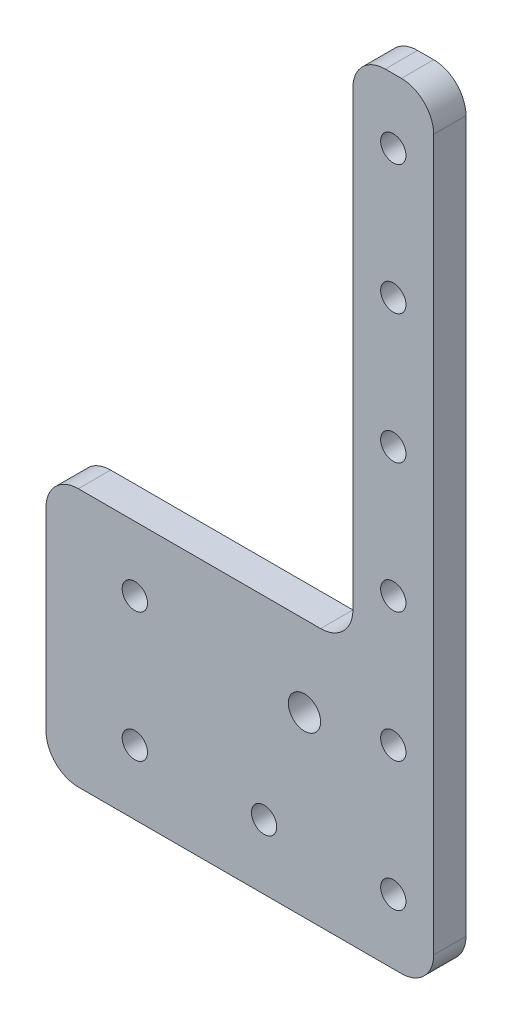
ISO-10303-21;
HEADER;
FILE_DESCRIPTION(('STEP AP214'),'2;1');
FILE_NAME('part.step','',(''),(''),'','','');
FILE_SCHEMA(('AUTOMOTIVE_DESIGN { 1 0 10303 214 1 1 1 1 }'));
ENDSEC;
DATA;
#1=APPLICATION_CONTEXT('core data for automotive mechanical design processes');
#2=APPLICATION_PROTOCOL_DEFINITION('international standard','automotive_design',2000,#1);
#3=PRODUCT_CONTEXT('',#1,'mechanical');
#4=PRODUCT('Part','Part','',(#3));
#5=PRODUCT_RELATED_PRODUCT_CATEGORY('part','',(#4));
#6=PRODUCT_DEFINITION_FORMATION('','',#4);
#7=PRODUCT_DEFINITION_CONTEXT('part definition',#1,'design');
#8=PRODUCT_DEFINITION('design','',#6,#7);
#9=PRODUCT_DEFINITION_SHAPE('','',#8);
#10=(LENGTH_UNIT() NAMED_UNIT(*) SI_UNIT(.MILLI.,.METRE.));
#11=(NAMED_UNIT(*) PLANE_ANGLE_UNIT() SI_UNIT($,.RADIAN.));
#12=(NAMED_UNIT(*) SI_UNIT($,.STERADIAN.) SOLID_ANGLE_UNIT());
#13=UNCERTAINTY_MEASURE_WITH_UNIT(LENGTH_MEASURE(1.E-05),#10,'distance_accuracy_value','');
#14=(GEOMETRIC_REPRESENTATION_CONTEXT(3) GLOBAL_UNCERTAINTY_ASSIGNED_CONTEXT((#13)) GLOBAL_UNIT_ASSIGNED_CONTEXT((#10,
#11,#12)) REPRESENTATION_CONTEXT('',''));
#15=CARTESIAN_POINT('',(0.,0.,0.));
#16=DIRECTION('',(0.,0.,1.));
#17=DIRECTION('',(1.,0.,0.));
#18=AXIS2_PLACEMENT_3D('',#15,#16,#17);
#19=CARTESIAN_POINT('',(0.,0.,3.175));
#20=DIRECTION('',(0.,0.,1.));
#21=DIRECTION('',(1.,0.,0.));
#22=AXIS2_PLACEMENT_3D('',#19,#20,#21);
#23=PLANE('',#22);
#24=CARTESIAN_POINT('',(284.1625,38.1,3.175));
#25=DIRECTION('',(0.,0.,1.));
#26=DIRECTION('',(1.,0.,0.));
#27=AXIS2_PLACEMENT_3D('',#24,#25,#26);
#28=CIRCLE('',#27,2.48920000000001);
#29=CARTESIAN_POINT('',(286.6517,38.1,3.175));
#30=VERTEX_POINT('',#29);
#31=EDGE_CURVE('E523',#30,#30,#28,.T.);
#32=ORIENTED_EDGE('',*,*,#31,.F.);
#33=EDGE_LOOP('',(#32));
#34=FACE_BOUND('',#33,.T.);
#35=CARTESIAN_POINT('',(317.5,34.925,3.175));
#36=DIRECTION('',(0.,0.,1.));
#37=DIRECTION('',(1.,0.,0.));
#38=AXIS2_PLACEMENT_3D('',#35,#36,#37);
#39=CIRCLE('',#38,3.17499999999997);
#40=CARTESIAN_POINT('',(320.675,34.925,3.175));
#41=VERTEX_POINT('',#40);
#42=EDGE_CURVE('E531',#41,#41,#39,.T.);
#43=ORIENTED_EDGE('',*,*,#42,.F.);
#44=EDGE_LOOP('',(#43));
#45=FACE_BOUND('',#44,.T.);
#46=CARTESIAN_POINT('',(334.9625,38.0999999999999,3.175));
#47=DIRECTION('',(0.,0.,1.));
#48=DIRECTION('',(1.,0.,0.));
#49=AXIS2_PLACEMENT_3D('',#46,#47,#48);
#50=CIRCLE('',#49,2.48920000000001);
#51=CARTESIAN_POINT('',(337.4517,38.0999999999999,3.175));
#52=VERTEX_POINT('',#51);
#53=EDGE_CURVE('E539',#52,#52,#50,.T.);
#54=ORIENTED_EDGE('',*,*,#53,.F.);
#55=EDGE_LOOP('',(#54));
#56=FACE_BOUND('',#55,.T.);
#57=CARTESIAN_POINT('',(334.9625,88.8999999999999,3.175));
#58=DIRECTION('',(0.,0.,1.));
#59=DIRECTION('',(1.,0.,0.));
#60=AXIS2_PLACEMENT_3D('',#57,#58,#59);
#61=CIRCLE('',#60,2.48920000000001);
#62=CARTESIAN_POINT('',(337.4517,88.8999999999999,3.175));
#63=VERTEX_POINT('',#62);
#64=EDGE_CURVE('E547',#63,#63,#61,.T.);
#65=ORIENTED_EDGE('',*,*,#64,.F.);
#66=EDGE_LOOP('',(#65));
#67=FACE_BOUND('',#66,.T.);
#68=CARTESIAN_POINT('',(334.9625,139.7,3.175));
#69=DIRECTION('',(0.,0.,1.));
#70=DIRECTION('',(1.,0.,0.));
#71=AXIS2_PLACEMENT_3D('',#68,#69,#70);
#72=CIRCLE('',#71,2.48920000000001);
#73=CARTESIAN_POINT('',(337.4517,139.7,3.175));
#74=VERTEX_POINT('',#73);
#75=EDGE_CURVE('E235',#74,#74,#72,.T.);
#76=ORIENTED_EDGE('',*,*,#75,.F.);
#77=EDGE_LOOP('',(#76));
#78=FACE_BOUND('',#77,.T.);
#79=DIRECTION('',(-1.,0.,0.));
#80=VECTOR('',#79,1.);
#81=CARTESIAN_POINT('',(327.025,50.7999999999999,3.175));
#82=LINE('',#81,#80);
#83=CARTESIAN_POINT('',(320.675,50.7999999999999,3.175));
#84=VERTEX_POINT('',#83);
#85=CARTESIAN_POINT('',(273.05,50.8,3.175));
#86=VERTEX_POINT('',#85);
#87=EDGE_CURVE('E222',#84,#86,#82,.T.);
#88=ORIENTED_EDGE('',*,*,#87,.T.);
#89=CARTESIAN_POINT('',(273.05,44.45,3.175));
#90=DIRECTION('',(0.,0.,1.));
#91=DIRECTION('',(1.,0.,0.));
#92=AXIS2_PLACEMENT_3D('',#89,#90,#91);
#93=CIRCLE('',#92,6.35);
#94=CARTESIAN_POINT('',(266.7,44.45,3.175));
#95=VERTEX_POINT('',#94);
#96=EDGE_CURVE('E186',#86,#95,#93,.T.);
#97=ORIENTED_EDGE('',*,*,#96,.T.);
#98=DIRECTION('',(0.,-1.,0.));
#99=VECTOR('',#98,1.);
#100=CARTESIAN_POINT('',(266.7,50.8,3.175));
#101=LINE('',#100,#99);
#102=CARTESIAN_POINT('',(266.7,6.34999999999992,3.175));
#103=VERTEX_POINT('',#102);
#104=EDGE_CURVE('E149',#95,#103,#101,.T.);
#105=ORIENTED_EDGE('',*,*,#104,.T.);
#106=CARTESIAN_POINT('',(273.05,6.34999999999992,3.175));
#107=DIRECTION('',(0.,0.,1.));
#108=DIRECTION('',(1.,0.,0.));
#109=AXIS2_PLACEMENT_3D('',#106,#107,#108);
#110=CIRCLE('',#109,6.35);
#111=CARTESIAN_POINT('',(273.05,0.,3.175));
#112=VERTEX_POINT('',#111);
#113=EDGE_CURVE('E181',#103,#112,#110,.T.);
#114=ORIENTED_EDGE('',*,*,#113,.T.);
#115=DIRECTION('',(1.,0.,0.));
#116=VECTOR('',#115,1.);
#117=CARTESIAN_POINT('',(266.7,0.,3.175));
#118=LINE('',#117,#116);
#119=CARTESIAN_POINT('',(336.55,0.,3.175));
#120=VERTEX_POINT('',#119);
#121=EDGE_CURVE('E227',#112,#120,#118,.T.);
#122=ORIENTED_EDGE('',*,*,#121,.T.);
#123=CARTESIAN_POINT('',(336.55,6.34999999999992,3.175));
#124=DIRECTION('',(0.,0.,1.));
#125=DIRECTION('',(1.,0.,0.));
#126=AXIS2_PLACEMENT_3D('',#123,#124,#125);
#127=CIRCLE('',#126,6.35);
#128=CARTESIAN_POINT('',(342.9,6.34999999999991,3.175));
#129=VERTEX_POINT('',#128);
#130=EDGE_CURVE('E61',#120,#129,#127,.T.);
#131=ORIENTED_EDGE('',*,*,#130,.T.);
#132=DIRECTION('',(0.,1.,0.));
#133=VECTOR('',#132,1.);
#134=CARTESIAN_POINT('',(342.9,0.,3.175));
#135=LINE('',#134,#133);
#136=CARTESIAN_POINT('',(342.9,146.05,3.175));
#137=VERTEX_POINT('',#136);
#138=EDGE_CURVE('E169',#129,#137,#135,.T.);
#139=ORIENTED_EDGE('',*,*,#138,.T.);
#140=CARTESIAN_POINT('',(336.55,146.05,3.175));
#141=DIRECTION('',(0.,0.,1.));
#142=DIRECTION('',(1.,0.,0.));
#143=AXIS2_PLACEMENT_3D('',#140,#141,#142);
#144=CIRCLE('',#143,6.35);
#145=CARTESIAN_POINT('',(336.55,152.4,3.175));
#146=VERTEX_POINT('',#145);
#147=EDGE_CURVE('E184',#137,#146,#144,.T.);
#148=ORIENTED_EDGE('',*,*,#147,.T.);
#149=DIRECTION('',(-1.,0.,0.));
#150=VECTOR('',#149,1.);
#151=CARTESIAN_POINT('',(342.9,152.4,3.175));
#152=LINE('',#151,#150);
#153=CARTESIAN_POINT('',(333.375,152.4,3.175));
#154=VERTEX_POINT('',#153);
#155=EDGE_CURVE('E168',#146,#154,#152,.T.);
#156=ORIENTED_EDGE('',*,*,#155,.T.);
#157=CARTESIAN_POINT('',(333.375,146.05,3.175));
#158=DIRECTION('',(0.,0.,1.));
#159=DIRECTION('',(1.,0.,0.));
#160=AXIS2_PLACEMENT_3D('',#157,#158,#159);
#161=CIRCLE('',#160,6.35);
#162=CARTESIAN_POINT('',(327.025,146.05,3.175));
#163=VERTEX_POINT('',#162);
#164=EDGE_CURVE('E179',#154,#163,#161,.T.);
#165=ORIENTED_EDGE('',*,*,#164,.T.);
#166=DIRECTION('',(0.,-1.,0.));
#167=VECTOR('',#166,1.);
#168=CARTESIAN_POINT('',(327.025,152.4,3.175));
#169=LINE('',#168,#167);
#170=CARTESIAN_POINT('',(327.025,57.1499999999999,3.175));
#171=VERTEX_POINT('',#170);
#172=EDGE_CURVE('E223',#163,#171,#169,.T.);
#173=ORIENTED_EDGE('',*,*,#172,.T.);
#174=CARTESIAN_POINT('',(320.675,57.1499999999999,3.175));
#175=DIRECTION('',(0.,0.,1.));
#176=DIRECTION('',(1.,0.,0.));
#177=AXIS2_PLACEMENT_3D('',#174,#175,#176);
#178=CIRCLE('',#177,6.35);
#179=EDGE_CURVE('E11',#171,#84,#178,.F.);
#180=ORIENTED_EDGE('',*,*,#179,.T.);
#181=EDGE_LOOP('',(#88,#97,#105,#114,#122,#131,#139,#148,#156,#165,#173,#180));
#182=FACE_BOUND('',#181,.T.);
#183=CARTESIAN_POINT('',(334.9625,114.3,3.175));
#184=DIRECTION('',(0.,0.,1.));
#185=DIRECTION('',(1.,0.,0.));
#186=AXIS2_PLACEMENT_3D('',#183,#184,#185);
#187=CIRCLE('',#186,2.48920000000001);
#188=CARTESIAN_POINT('',(337.4517,114.3,3.175));
#189=VERTEX_POINT('',#188);
#190=EDGE_CURVE('E245',#189,#189,#187,.T.);
#191=ORIENTED_EDGE('',*,*,#190,.F.);
#192=EDGE_LOOP('',(#191));
#193=FACE_BOUND('',#192,.T.);
#194=CARTESIAN_POINT('',(334.9625,63.4999999999999,3.175));
#195=DIRECTION('',(0.,0.,1.));
#196=DIRECTION('',(1.,0.,0.));
#197=AXIS2_PLACEMENT_3D('',#194,#195,#196);
#198=CIRCLE('',#197,2.48920000000001);
#199=CARTESIAN_POINT('',(337.4517,63.4999999999999,3.175));
#200=VERTEX_POINT('',#199);
#201=EDGE_CURVE('E543',#200,#200,#198,.T.);
#202=ORIENTED_EDGE('',*,*,#201,.F.);
#203=EDGE_LOOP('',(#202));
#204=FACE_BOUND('',#203,.T.);
#205=CARTESIAN_POINT('',(334.9625,12.6999999999999,3.175));
#206=DIRECTION('',(0.,0.,1.));
#207=DIRECTION('',(1.,0.,0.));
#208=AXIS2_PLACEMENT_3D('',#205,#206,#207);
#209=CIRCLE('',#208,2.48920000000001);
#210=CARTESIAN_POINT('',(337.4517,12.6999999999999,3.175));
#211=VERTEX_POINT('',#210);
#212=EDGE_CURVE('E535',#211,#211,#209,.T.);
#213=ORIENTED_EDGE('',*,*,#212,.F.);
#214=EDGE_LOOP('',(#213));
#215=FACE_BOUND('',#214,.T.);
#216=CARTESIAN_POINT('',(309.5625,12.7,3.175));
#217=DIRECTION('',(0.,0.,1.));
#218=DIRECTION('',(1.,0.,0.));
#219=AXIS2_PLACEMENT_3D('',#216,#217,#218);
#220=CIRCLE('',#219,2.48920000000001);
#221=CARTESIAN_POINT('',(312.0517,12.7,3.175));
#222=VERTEX_POINT('',#221);
#223=EDGE_CURVE('E527',#222,#222,#220,.T.);
#224=ORIENTED_EDGE('',*,*,#223,.F.);
#225=EDGE_LOOP('',(#224));
#226=FACE_BOUND('',#225,.T.);
#227=CARTESIAN_POINT('',(284.1625,12.7,3.175));
#228=DIRECTION('',(0.,0.,1.));
#229=DIRECTION('',(1.,0.,0.));
#230=AXIS2_PLACEMENT_3D('',#227,#228,#229);
#231=CIRCLE('',#230,2.48920000000001);
#232=CARTESIAN_POINT('',(286.6517,12.7,3.175));
#233=VERTEX_POINT('',#232);
#234=EDGE_CURVE('E518',#233,#233,#231,.T.);
#235=ORIENTED_EDGE('',*,*,#234,.F.);
#236=EDGE_LOOP('',(#235));
#237=FACE_BOUND('',#236,.T.);
#238=ADVANCED_FACE('F39',(#34,#45,#56,#67,#78,#182,#193,#204,#215,#226,#237),#23,.T.);
#239=CARTESIAN_POINT('',(0.,0.,-3.175));
#240=DIRECTION('',(0.,0.,1.));
#241=DIRECTION('',(1.,0.,0.));
#242=AXIS2_PLACEMENT_3D('',#239,#240,#241);
#243=PLANE('',#242);
#244=DIRECTION('',(0.,-1.,0.));
#245=VECTOR('',#244,1.);
#246=CARTESIAN_POINT('',(266.7,50.8,-3.175));
#247=LINE('',#246,#245);
#248=CARTESIAN_POINT('',(266.7,44.45,-3.175));
#249=VERTEX_POINT('',#248);
#250=CARTESIAN_POINT('',(266.7,6.34999999999992,-3.175));
#251=VERTEX_POINT('',#250);
#252=EDGE_CURVE('E146',#249,#251,#247,.T.);
#253=ORIENTED_EDGE('',*,*,#252,.F.);
#254=CARTESIAN_POINT('',(273.05,44.45,-3.175));
#255=DIRECTION('',(0.,0.,1.));
#256=DIRECTION('',(1.,0.,0.));
#257=AXIS2_PLACEMENT_3D('',#254,#255,#256);
#258=CIRCLE('',#257,6.35);
#259=CARTESIAN_POINT('',(273.05,50.8,-3.175));
#260=VERTEX_POINT('',#259);
#261=EDGE_CURVE('E129',#249,#260,#258,.F.);
#262=ORIENTED_EDGE('',*,*,#261,.T.);
#263=DIRECTION('',(-1.,0.,0.));
#264=VECTOR('',#263,1.);
#265=CARTESIAN_POINT('',(327.025,50.7999999999999,-3.175));
#266=LINE('',#265,#264);
#267=CARTESIAN_POINT('',(320.675,50.7999999999999,-3.175));
#268=VERTEX_POINT('',#267);
#269=EDGE_CURVE('E158',#268,#260,#266,.T.);
#270=ORIENTED_EDGE('',*,*,#269,.F.);
#271=CARTESIAN_POINT('',(320.675,57.1499999999999,-3.175));
#272=DIRECTION('',(0.,0.,1.));
#273=DIRECTION('',(1.,0.,0.));
#274=AXIS2_PLACEMENT_3D('',#271,#272,#273);
#275=CIRCLE('',#274,6.35);
#276=CARTESIAN_POINT('',(327.025,57.1499999999999,-3.175));
#277=VERTEX_POINT('',#276);
#278=EDGE_CURVE('E47',#268,#277,#275,.T.);
#279=ORIENTED_EDGE('',*,*,#278,.T.);
#280=DIRECTION('',(0.,-1.,0.));
#281=VECTOR('',#280,1.);
#282=CARTESIAN_POINT('',(327.025,152.4,-3.175));
#283=LINE('',#282,#281);
#284=CARTESIAN_POINT('',(327.025,146.05,-3.175));
#285=VERTEX_POINT('',#284);
#286=EDGE_CURVE('E163',#285,#277,#283,.T.);
#287=ORIENTED_EDGE('',*,*,#286,.F.);
#288=CARTESIAN_POINT('',(333.375,146.05,-3.175));
#289=DIRECTION('',(0.,0.,1.));
#290=DIRECTION('',(1.,0.,0.));
#291=AXIS2_PLACEMENT_3D('',#288,#289,#290);
#292=CIRCLE('',#291,6.35);
#293=CARTESIAN_POINT('',(333.375,152.4,-3.175));
#294=VERTEX_POINT('',#293);
#295=EDGE_CURVE('E150',#285,#294,#292,.F.);
#296=ORIENTED_EDGE('',*,*,#295,.T.);
#297=DIRECTION('',(-1.,0.,0.));
#298=VECTOR('',#297,1.);
#299=CARTESIAN_POINT('',(342.9,152.4,-3.175));
#300=LINE('',#299,#298);
#301=CARTESIAN_POINT('',(336.55,152.4,-3.175));
#302=VERTEX_POINT('',#301);
#303=EDGE_CURVE('E216',#302,#294,#300,.T.);
#304=ORIENTED_EDGE('',*,*,#303,.F.);
#305=CARTESIAN_POINT('',(336.55,146.05,-3.175));
#306=DIRECTION('',(0.,0.,1.));
#307=DIRECTION('',(1.,0.,0.));
#308=AXIS2_PLACEMENT_3D('',#305,#306,#307);
#309=CIRCLE('',#308,6.35);
#310=CARTESIAN_POINT('',(342.9,146.05,-3.175));
#311=VERTEX_POINT('',#310);
#312=EDGE_CURVE('E140',#302,#311,#309,.F.);
#313=ORIENTED_EDGE('',*,*,#312,.T.);
#314=DIRECTION('',(0.,1.,0.));
#315=VECTOR('',#314,1.);
#316=CARTESIAN_POINT('',(342.9,0.,-3.175));
#317=LINE('',#316,#315);
#318=CARTESIAN_POINT('',(342.9,6.34999999999991,-3.175));
#319=VERTEX_POINT('',#318);
#320=EDGE_CURVE('E161',#319,#311,#317,.T.);
#321=ORIENTED_EDGE('',*,*,#320,.F.);
#322=CARTESIAN_POINT('',(336.55,6.34999999999992,-3.175));
#323=DIRECTION('',(0.,0.,1.));
#324=DIRECTION('',(1.,0.,0.));
#325=AXIS2_PLACEMENT_3D('',#322,#323,#324);
#326=CIRCLE('',#325,6.35);
#327=CARTESIAN_POINT('',(336.55,0.,-3.175));
#328=VERTEX_POINT('',#327);
#329=EDGE_CURVE('E173',#319,#328,#326,.F.);
#330=ORIENTED_EDGE('',*,*,#329,.T.);
#331=DIRECTION('',(1.,0.,0.));
#332=VECTOR('',#331,1.);
#333=CARTESIAN_POINT('',(266.7,0.,-3.175));
#334=LINE('',#333,#332);
#335=CARTESIAN_POINT('',(273.05,0.,-3.175));
#336=VERTEX_POINT('',#335);
#337=EDGE_CURVE('E157',#336,#328,#334,.T.);
#338=ORIENTED_EDGE('',*,*,#337,.F.);
#339=CARTESIAN_POINT('',(273.05,6.34999999999992,-3.175));
#340=DIRECTION('',(0.,0.,1.));
#341=DIRECTION('',(1.,0.,0.));
#342=AXIS2_PLACEMENT_3D('',#339,#340,#341);
#343=CIRCLE('',#342,6.35);
#344=EDGE_CURVE('E156',#336,#251,#343,.F.);
#345=ORIENTED_EDGE('',*,*,#344,.T.);
#346=EDGE_LOOP('',(#253,#262,#270,#279,#287,#296,#304,#313,#321,#330,#338,#345));
#347=FACE_BOUND('',#346,.T.);
#348=CARTESIAN_POINT('',(334.9625,139.7,-3.175));
#349=DIRECTION('',(0.,0.,1.));
#350=DIRECTION('',(1.,0.,0.));
#351=AXIS2_PLACEMENT_3D('',#348,#349,#350);
#352=CIRCLE('',#351,2.48920000000001);
#353=CARTESIAN_POINT('',(337.4517,139.7,-3.175));
#354=VERTEX_POINT('',#353);
#355=EDGE_CURVE('E240',#354,#354,#352,.T.);
#356=ORIENTED_EDGE('',*,*,#355,.T.);
#357=EDGE_LOOP('',(#356));
#358=FACE_BOUND('',#357,.T.);
#359=CARTESIAN_POINT('',(334.9625,114.3,-3.175));
#360=DIRECTION('',(0.,0.,1.));
#361=DIRECTION('',(1.,0.,0.));
#362=AXIS2_PLACEMENT_3D('',#359,#360,#361);
#363=CIRCLE('',#362,2.48920000000001);
#364=CARTESIAN_POINT('',(337.4517,114.3,-3.175));
#365=VERTEX_POINT('',#364);
#366=EDGE_CURVE('E248',#365,#365,#363,.T.);
#367=ORIENTED_EDGE('',*,*,#366,.T.);
#368=EDGE_LOOP('',(#367));
#369=FACE_BOUND('',#368,.T.);
#370=CARTESIAN_POINT('',(334.9625,88.8999999999999,-3.175));
#371=DIRECTION('',(0.,0.,1.));
#372=DIRECTION('',(1.,0.,0.));
#373=AXIS2_PLACEMENT_3D('',#370,#371,#372);
#374=CIRCLE('',#373,2.48920000000001);
#375=CARTESIAN_POINT('',(337.4517,88.8999999999999,-3.175));
#376=VERTEX_POINT('',#375);
#377=EDGE_CURVE('E489',#376,#376,#374,.T.);
#378=ORIENTED_EDGE('',*,*,#377,.T.);
#379=EDGE_LOOP('',(#378));
#380=FACE_BOUND('',#379,.T.);
#381=CARTESIAN_POINT('',(334.9625,63.4999999999999,-3.175));
#382=DIRECTION('',(0.,0.,1.));
#383=DIRECTION('',(1.,0.,0.));
#384=AXIS2_PLACEMENT_3D('',#381,#382,#383);
#385=CIRCLE('',#384,2.48920000000001);
#386=CARTESIAN_POINT('',(337.4517,63.4999999999999,-3.175));
#387=VERTEX_POINT('',#386);
#388=EDGE_CURVE('E493',#387,#387,#385,.T.);
#389=ORIENTED_EDGE('',*,*,#388,.T.);
#390=EDGE_LOOP('',(#389));
#391=FACE_BOUND('',#390,.T.);
#392=CARTESIAN_POINT('',(334.9625,38.0999999999999,-3.175));
#393=DIRECTION('',(0.,0.,1.));
#394=DIRECTION('',(1.,0.,0.));
#395=AXIS2_PLACEMENT_3D('',#392,#393,#394);
#396=CIRCLE('',#395,2.48920000000001);
#397=CARTESIAN_POINT('',(337.4517,38.0999999999999,-3.175));
#398=VERTEX_POINT('',#397);
#399=EDGE_CURVE('E497',#398,#398,#396,.T.);
#400=ORIENTED_EDGE('',*,*,#399,.T.);
#401=EDGE_LOOP('',(#400));
#402=FACE_BOUND('',#401,.T.);
#403=CARTESIAN_POINT('',(334.9625,12.6999999999999,-3.175));
#404=DIRECTION('',(0.,0.,1.));
#405=DIRECTION('',(1.,0.,0.));
#406=AXIS2_PLACEMENT_3D('',#403,#404,#405);
#407=CIRCLE('',#406,2.48920000000001);
#408=CARTESIAN_POINT('',(337.4517,12.6999999999999,-3.175));
#409=VERTEX_POINT('',#408);
#410=EDGE_CURVE('E501',#409,#409,#407,.T.);
#411=ORIENTED_EDGE('',*,*,#410,.T.);
#412=EDGE_LOOP('',(#411));
#413=FACE_BOUND('',#412,.T.);
#414=CARTESIAN_POINT('',(317.5,34.925,-3.175));
#415=DIRECTION('',(0.,0.,1.));
#416=DIRECTION('',(1.,0.,0.));
#417=AXIS2_PLACEMENT_3D('',#414,#415,#416);
#418=CIRCLE('',#417,3.17499999999997);
#419=CARTESIAN_POINT('',(320.675,34.925,-3.175));
#420=VERTEX_POINT('',#419);
#421=EDGE_CURVE('E505',#420,#420,#418,.T.);
#422=ORIENTED_EDGE('',*,*,#421,.T.);
#423=EDGE_LOOP('',(#422));
#424=FACE_BOUND('',#423,.T.);
#425=CARTESIAN_POINT('',(309.5625,12.7,-3.175));
#426=DIRECTION('',(0.,0.,1.));
#427=DIRECTION('',(1.,0.,0.));
#428=AXIS2_PLACEMENT_3D('',#425,#426,#427);
#429=CIRCLE('',#428,2.48920000000001);
#430=CARTESIAN_POINT('',(312.0517,12.7,-3.175));
#431=VERTEX_POINT('',#430);
#432=EDGE_CURVE('E509',#431,#431,#429,.T.);
#433=ORIENTED_EDGE('',*,*,#432,.T.);
#434=EDGE_LOOP('',(#433));
#435=FACE_BOUND('',#434,.T.);
#436=CARTESIAN_POINT('',(284.1625,38.1,-3.175));
#437=DIRECTION('',(0.,0.,1.));
#438=DIRECTION('',(1.,0.,0.));
#439=AXIS2_PLACEMENT_3D('',#436,#437,#438);
#440=CIRCLE('',#439,2.48920000000001);
#441=CARTESIAN_POINT('',(286.6517,38.1,-3.175));
#442=VERTEX_POINT('',#441);
#443=EDGE_CURVE('E513',#442,#442,#440,.T.);
#444=ORIENTED_EDGE('',*,*,#443,.T.);
#445=EDGE_LOOP('',(#444));
#446=FACE_BOUND('',#445,.T.);
#447=CARTESIAN_POINT('',(284.1625,12.7,-3.175));
#448=DIRECTION('',(0.,0.,1.));
#449=DIRECTION('',(1.,0.,0.));
#450=AXIS2_PLACEMENT_3D('',#447,#448,#449);
#451=CIRCLE('',#450,2.48920000000001);
#452=CARTESIAN_POINT('',(286.6517,12.7,-3.175));
#453=VERTEX_POINT('',#452);
#454=EDGE_CURVE('E516',#453,#453,#451,.T.);
#455=ORIENTED_EDGE('',*,*,#454,.T.);
#456=EDGE_LOOP('',(#455));
#457=FACE_BOUND('',#456,.T.);
#458=ADVANCED_FACE('F153',(#347,#358,#369,#380,#391,#402,#413,#424,#435,#446,#457),#243,.F.);
#459=CARTESIAN_POINT('',(342.9,152.4,3.175));
#460=DIRECTION('',(0.,-1.,0.));
#461=DIRECTION('',(0.,0.,-1.));
#462=AXIS2_PLACEMENT_3D('',#459,#460,#461);
#463=PLANE('',#462);
#464=ORIENTED_EDGE('',*,*,#155,.F.);
#465=DIRECTION('',(0.,0.,-1.));
#466=VECTOR('',#465,1.);
#467=CARTESIAN_POINT('',(336.55,152.4,3.175));
#468=LINE('',#467,#466);
#469=EDGE_CURVE('E195',#146,#302,#468,.T.);
#470=ORIENTED_EDGE('',*,*,#469,.T.);
#471=ORIENTED_EDGE('',*,*,#303,.T.);
#472=DIRECTION('',(0.,0.,-1.));
#473=VECTOR('',#472,1.);
#474=CARTESIAN_POINT('',(333.375,152.4,3.175));
#475=LINE('',#474,#473);
#476=EDGE_CURVE('E193',#294,#154,#475,.F.);
#477=ORIENTED_EDGE('',*,*,#476,.T.);
#478=EDGE_LOOP('',(#464,#470,#471,#477));
#479=FACE_BOUND('',#478,.T.);
#480=ADVANCED_FACE('F261',(#479),#463,.F.);
#481=CARTESIAN_POINT('',(327.025,152.4,3.175));
#482=DIRECTION('',(1.,0.,0.));
#483=DIRECTION('',(0.,0.,-1.));
#484=AXIS2_PLACEMENT_3D('',#481,#482,#483);
#485=PLANE('',#484);
#486=ORIENTED_EDGE('',*,*,#286,.T.);
#487=DIRECTION('',(0.,0.,-1.));
#488=VECTOR('',#487,1.);
#489=CARTESIAN_POINT('',(327.025,57.1499999999999,3.175));
#490=LINE('',#489,#488);
#491=EDGE_CURVE('E191',#277,#171,#490,.F.);
#492=ORIENTED_EDGE('',*,*,#491,.T.);
#493=ORIENTED_EDGE('',*,*,#172,.F.);
#494=DIRECTION('',(0.,0.,-1.));
#495=VECTOR('',#494,1.);
#496=CARTESIAN_POINT('',(327.025,146.05,3.175));
#497=LINE('',#496,#495);
#498=EDGE_CURVE('E188',#163,#285,#497,.T.);
#499=ORIENTED_EDGE('',*,*,#498,.T.);
#500=EDGE_LOOP('',(#486,#492,#493,#499));
#501=FACE_BOUND('',#500,.T.);
#502=ADVANCED_FACE('F212',(#501),#485,.F.);
#503=CARTESIAN_POINT('',(327.025,50.7999999999999,3.175));
#504=DIRECTION('',(0.,-1.,0.));
#505=DIRECTION('',(1.,0.,0.));
#506=AXIS2_PLACEMENT_3D('',#503,#504,#505);
#507=PLANE('',#506);
#508=ORIENTED_EDGE('',*,*,#269,.T.);
#509=DIRECTION('',(0.,0.,-1.));
#510=VECTOR('',#509,1.);
#511=CARTESIAN_POINT('',(273.05,50.8,3.175));
#512=LINE('',#511,#510);
#513=EDGE_CURVE('E134',#260,#86,#512,.F.);
#514=ORIENTED_EDGE('',*,*,#513,.T.);
#515=ORIENTED_EDGE('',*,*,#87,.F.);
#516=DIRECTION('',(0.,0.,-1.));
#517=VECTOR('',#516,1.);
#518=CARTESIAN_POINT('',(320.675,50.7999999999999,-3.175));
#519=LINE('',#518,#517);
#520=EDGE_CURVE('E139',#84,#268,#519,.T.);
#521=ORIENTED_EDGE('',*,*,#520,.T.);
#522=EDGE_LOOP('',(#508,#514,#515,#521));
#523=FACE_BOUND('',#522,.T.);
#524=ADVANCED_FACE('F225',(#523),#507,.F.);
#525=CARTESIAN_POINT('',(266.7,50.8,3.175));
#526=DIRECTION('',(1.,0.,0.));
#527=DIRECTION('',(0.,0.,-1.));
#528=AXIS2_PLACEMENT_3D('',#525,#526,#527);
#529=PLANE('',#528);
#530=ORIENTED_EDGE('',*,*,#104,.F.);
#531=DIRECTION('',(0.,0.,-1.));
#532=VECTOR('',#531,1.);
#533=CARTESIAN_POINT('',(266.7,44.45,3.175));
#534=LINE('',#533,#532);
#535=EDGE_CURVE('E133',#95,#249,#534,.T.);
#536=ORIENTED_EDGE('',*,*,#535,.T.);
#537=ORIENTED_EDGE('',*,*,#252,.T.);
#538=DIRECTION('',(0.,0.,-1.));
#539=VECTOR('',#538,1.);
#540=CARTESIAN_POINT('',(266.7,6.34999999999992,3.175));
#541=LINE('',#540,#539);
#542=EDGE_CURVE('E151',#251,#103,#541,.F.);
#543=ORIENTED_EDGE('',*,*,#542,.T.);
#544=EDGE_LOOP('',(#530,#536,#537,#543));
#545=FACE_BOUND('',#544,.T.);
#546=ADVANCED_FACE('F145',(#545),#529,.F.);
#547=CARTESIAN_POINT('',(266.7,0.,3.175));
#548=DIRECTION('',(0.,1.,0.));
#549=DIRECTION('',(0.,0.,1.));
#550=AXIS2_PLACEMENT_3D('',#547,#548,#549);
#551=PLANE('',#550);
#552=ORIENTED_EDGE('',*,*,#337,.T.);
#553=DIRECTION('',(0.,0.,-1.));
#554=VECTOR('',#553,1.);
#555=CARTESIAN_POINT('',(336.55,0.,3.175));
#556=LINE('',#555,#554);
#557=EDGE_CURVE('E205',#328,#120,#556,.F.);
#558=ORIENTED_EDGE('',*,*,#557,.T.);
#559=ORIENTED_EDGE('',*,*,#121,.F.);
#560=DIRECTION('',(0.,0.,-1.));
#561=VECTOR('',#560,1.);
#562=CARTESIAN_POINT('',(273.05,0.,3.175));
#563=LINE('',#562,#561);
#564=EDGE_CURVE('E202',#112,#336,#563,.T.);
#565=ORIENTED_EDGE('',*,*,#564,.T.);
#566=EDGE_LOOP('',(#552,#558,#559,#565));
#567=FACE_BOUND('',#566,.T.);
#568=ADVANCED_FACE('F285',(#567),#551,.F.);
#569=CARTESIAN_POINT('',(342.9,0.,3.175));
#570=DIRECTION('',(-1.,0.,0.));
#571=DIRECTION('',(0.,0.,1.));
#572=AXIS2_PLACEMENT_3D('',#569,#570,#571);
#573=PLANE('',#572);
#574=ORIENTED_EDGE('',*,*,#320,.T.);
#575=DIRECTION('',(0.,0.,-1.));
#576=VECTOR('',#575,1.);
#577=CARTESIAN_POINT('',(342.9,146.05,3.175));
#578=LINE('',#577,#576);
#579=EDGE_CURVE('E54',#311,#137,#578,.F.);
#580=ORIENTED_EDGE('',*,*,#579,.T.);
#581=ORIENTED_EDGE('',*,*,#138,.F.);
#582=DIRECTION('',(0.,0.,-1.));
#583=VECTOR('',#582,1.);
#584=CARTESIAN_POINT('',(342.9,6.34999999999992,3.175));
#585=LINE('',#584,#583);
#586=EDGE_CURVE('E198',#129,#319,#585,.T.);
#587=ORIENTED_EDGE('',*,*,#586,.T.);
#588=EDGE_LOOP('',(#574,#580,#581,#587));
#589=FACE_BOUND('',#588,.T.);
#590=ADVANCED_FACE('F258',(#589),#573,.F.);
#591=CARTESIAN_POINT('',(334.9625,139.7,3.175));
#592=DIRECTION('',(0.,0.,-1.));
#593=DIRECTION('',(-1.,0.,0.));
#594=AXIS2_PLACEMENT_3D('',#591,#592,#593);
#595=CYLINDRICAL_SURFACE('',#594,2.48920000000001);
#596=ORIENTED_EDGE('',*,*,#75,.T.);
#597=EDGE_LOOP('',(#596));
#598=FACE_BOUND('',#597,.T.);
#599=ORIENTED_EDGE('',*,*,#355,.F.);
#600=EDGE_LOOP('',(#599));
#601=FACE_BOUND('',#600,.T.);
#602=ADVANCED_FACE('F280',(#598,#601),#595,.F.);
#603=CARTESIAN_POINT('',(334.9625,114.3,3.175));
#604=DIRECTION('',(0.,0.,-1.));
#605=DIRECTION('',(-1.,0.,0.));
#606=AXIS2_PLACEMENT_3D('',#603,#604,#605);
#607=CYLINDRICAL_SURFACE('',#606,2.48920000000001);
#608=ORIENTED_EDGE('',*,*,#190,.T.);
#609=EDGE_LOOP('',(#608));
#610=FACE_BOUND('',#609,.T.);
#611=ORIENTED_EDGE('',*,*,#366,.F.);
#612=EDGE_LOOP('',(#611));
#613=FACE_BOUND('',#612,.T.);
#614=ADVANCED_FACE('F432',(#610,#613),#607,.F.);
#615=CARTESIAN_POINT('',(334.9625,88.8999999999999,3.175));
#616=DIRECTION('',(0.,0.,-1.));
#617=DIRECTION('',(-1.,0.,0.));
#618=AXIS2_PLACEMENT_3D('',#615,#616,#617);
#619=CYLINDRICAL_SURFACE('',#618,2.48920000000001);
#620=ORIENTED_EDGE('',*,*,#64,.T.);
#621=EDGE_LOOP('',(#620));
#622=FACE_BOUND('',#621,.T.);
#623=ORIENTED_EDGE('',*,*,#377,.F.);
#624=EDGE_LOOP('',(#623));
#625=FACE_BOUND('',#624,.T.);
#626=ADVANCED_FACE('F423',(#622,#625),#619,.F.);
#627=CARTESIAN_POINT('',(334.9625,63.4999999999999,3.175));
#628=DIRECTION('',(0.,0.,-1.));
#629=DIRECTION('',(-1.,0.,0.));
#630=AXIS2_PLACEMENT_3D('',#627,#628,#629);
#631=CYLINDRICAL_SURFACE('',#630,2.48920000000001);
#632=ORIENTED_EDGE('',*,*,#201,.T.);
#633=EDGE_LOOP('',(#632));
#634=FACE_BOUND('',#633,.T.);
#635=ORIENTED_EDGE('',*,*,#388,.F.);
#636=EDGE_LOOP('',(#635));
#637=FACE_BOUND('',#636,.T.);
#638=ADVANCED_FACE('F414',(#634,#637),#631,.F.);
#639=CARTESIAN_POINT('',(334.9625,38.0999999999999,3.175));
#640=DIRECTION('',(0.,0.,-1.));
#641=DIRECTION('',(-1.,0.,0.));
#642=AXIS2_PLACEMENT_3D('',#639,#640,#641);
#643=CYLINDRICAL_SURFACE('',#642,2.48920000000001);
#644=ORIENTED_EDGE('',*,*,#53,.T.);
#645=EDGE_LOOP('',(#644));
#646=FACE_BOUND('',#645,.T.);
#647=ORIENTED_EDGE('',*,*,#399,.F.);
#648=EDGE_LOOP('',(#647));
#649=FACE_BOUND('',#648,.T.);
#650=ADVANCED_FACE('F405',(#646,#649),#643,.F.);
#651=CARTESIAN_POINT('',(334.9625,12.6999999999999,3.175));
#652=DIRECTION('',(0.,0.,-1.));
#653=DIRECTION('',(-1.,0.,0.));
#654=AXIS2_PLACEMENT_3D('',#651,#652,#653);
#655=CYLINDRICAL_SURFACE('',#654,2.48920000000001);
#656=ORIENTED_EDGE('',*,*,#212,.T.);
#657=EDGE_LOOP('',(#656));
#658=FACE_BOUND('',#657,.T.);
#659=ORIENTED_EDGE('',*,*,#410,.F.);
#660=EDGE_LOOP('',(#659));
#661=FACE_BOUND('',#660,.T.);
#662=ADVANCED_FACE('F396',(#658,#661),#655,.F.);
#663=CARTESIAN_POINT('',(317.5,34.925,3.175));
#664=DIRECTION('',(0.,0.,-1.));
#665=DIRECTION('',(-1.,0.,0.));
#666=AXIS2_PLACEMENT_3D('',#663,#664,#665);
#667=CYLINDRICAL_SURFACE('',#666,3.17499999999997);
#668=ORIENTED_EDGE('',*,*,#42,.T.);
#669=EDGE_LOOP('',(#668));
#670=FACE_BOUND('',#669,.T.);
#671=ORIENTED_EDGE('',*,*,#421,.F.);
#672=EDGE_LOOP('',(#671));
#673=FACE_BOUND('',#672,.T.);
#674=ADVANCED_FACE('F387',(#670,#673),#667,.F.);
#675=CARTESIAN_POINT('',(309.5625,12.7,3.175));
#676=DIRECTION('',(0.,0.,-1.));
#677=DIRECTION('',(-1.,0.,0.));
#678=AXIS2_PLACEMENT_3D('',#675,#676,#677);
#679=CYLINDRICAL_SURFACE('',#678,2.48920000000001);
#680=ORIENTED_EDGE('',*,*,#223,.T.);
#681=EDGE_LOOP('',(#680));
#682=FACE_BOUND('',#681,.T.);
#683=ORIENTED_EDGE('',*,*,#432,.F.);
#684=EDGE_LOOP('',(#683));
#685=FACE_BOUND('',#684,.T.);
#686=ADVANCED_FACE('F378',(#682,#685),#679,.F.);
#687=CARTESIAN_POINT('',(284.1625,38.1,3.175));
#688=DIRECTION('',(0.,0.,-1.));
#689=DIRECTION('',(-1.,0.,0.));
#690=AXIS2_PLACEMENT_3D('',#687,#688,#689);
#691=CYLINDRICAL_SURFACE('',#690,2.48920000000001);
#692=ORIENTED_EDGE('',*,*,#31,.T.);
#693=EDGE_LOOP('',(#692));
#694=FACE_BOUND('',#693,.T.);
#695=ORIENTED_EDGE('',*,*,#443,.F.);
#696=EDGE_LOOP('',(#695));
#697=FACE_BOUND('',#696,.T.);
#698=ADVANCED_FACE('F369',(#694,#697),#691,.F.);
#699=CARTESIAN_POINT('',(284.1625,12.7,3.175));
#700=DIRECTION('',(0.,0.,-1.));
#701=DIRECTION('',(-1.,0.,0.));
#702=AXIS2_PLACEMENT_3D('',#699,#700,#701);
#703=CYLINDRICAL_SURFACE('',#702,2.48920000000001);
#704=ORIENTED_EDGE('',*,*,#234,.T.);
#705=EDGE_LOOP('',(#704));
#706=FACE_BOUND('',#705,.T.);
#707=ORIENTED_EDGE('',*,*,#454,.F.);
#708=EDGE_LOOP('',(#707));
#709=FACE_BOUND('',#708,.T.);
#710=ADVANCED_FACE('F319',(#706,#709),#703,.F.);
#711=CARTESIAN_POINT('',(273.05,44.45,3.175));
#712=DIRECTION('',(0.,0.,-1.));
#713=DIRECTION('',(-1.,0.,0.));
#714=AXIS2_PLACEMENT_3D('',#711,#712,#713);
#715=CYLINDRICAL_SURFACE('',#714,6.35);
#716=ORIENTED_EDGE('',*,*,#96,.F.);
#717=ORIENTED_EDGE('',*,*,#513,.F.);
#718=ORIENTED_EDGE('',*,*,#261,.F.);
#719=ORIENTED_EDGE('',*,*,#535,.F.);
#720=EDGE_LOOP('',(#716,#717,#718,#719));
#721=FACE_BOUND('',#720,.T.);
#722=ADVANCED_FACE('F132',(#721),#715,.T.);
#723=CARTESIAN_POINT('',(320.675,57.1499999999999,3.175));
#724=DIRECTION('',(0.,0.,1.));
#725=DIRECTION('',(1.,0.,0.));
#726=AXIS2_PLACEMENT_3D('',#723,#724,#725);
#727=CYLINDRICAL_SURFACE('',#726,6.35);
#728=ORIENTED_EDGE('',*,*,#179,.F.);
#729=ORIENTED_EDGE('',*,*,#491,.F.);
#730=ORIENTED_EDGE('',*,*,#278,.F.);
#731=ORIENTED_EDGE('',*,*,#520,.F.);
#732=EDGE_LOOP('',(#728,#729,#730,#731));
#733=FACE_BOUND('',#732,.T.);
#734=ADVANCED_FACE('F218',(#733),#727,.F.);
#735=CARTESIAN_POINT('',(336.55,146.05,3.175));
#736=DIRECTION('',(0.,0.,-1.));
#737=DIRECTION('',(-1.,0.,0.));
#738=AXIS2_PLACEMENT_3D('',#735,#736,#737);
#739=CYLINDRICAL_SURFACE('',#738,6.35);
#740=ORIENTED_EDGE('',*,*,#147,.F.);
#741=ORIENTED_EDGE('',*,*,#579,.F.);
#742=ORIENTED_EDGE('',*,*,#312,.F.);
#743=ORIENTED_EDGE('',*,*,#469,.F.);
#744=EDGE_LOOP('',(#740,#741,#742,#743));
#745=FACE_BOUND('',#744,.T.);
#746=ADVANCED_FACE('F260',(#745),#739,.T.);
#747=CARTESIAN_POINT('',(336.55,6.34999999999992,3.175));
#748=DIRECTION('',(0.,0.,-1.));
#749=DIRECTION('',(-1.,0.,0.));
#750=AXIS2_PLACEMENT_3D('',#747,#748,#749);
#751=CYLINDRICAL_SURFACE('',#750,6.35);
#752=ORIENTED_EDGE('',*,*,#130,.F.);
#753=ORIENTED_EDGE('',*,*,#557,.F.);
#754=ORIENTED_EDGE('',*,*,#329,.F.);
#755=ORIENTED_EDGE('',*,*,#586,.F.);
#756=EDGE_LOOP('',(#752,#753,#754,#755));
#757=FACE_BOUND('',#756,.T.);
#758=ADVANCED_FACE('F334',(#757),#751,.T.);
#759=CARTESIAN_POINT('',(273.05,6.34999999999992,3.175));
#760=DIRECTION('',(0.,0.,-1.));
#761=DIRECTION('',(-1.,0.,0.));
#762=AXIS2_PLACEMENT_3D('',#759,#760,#761);
#763=CYLINDRICAL_SURFACE('',#762,6.35);
#764=ORIENTED_EDGE('',*,*,#113,.F.);
#765=ORIENTED_EDGE('',*,*,#542,.F.);
#766=ORIENTED_EDGE('',*,*,#344,.F.);
#767=ORIENTED_EDGE('',*,*,#564,.F.);
#768=EDGE_LOOP('',(#764,#765,#766,#767));
#769=FACE_BOUND('',#768,.T.);
#770=ADVANCED_FACE('F342',(#769),#763,.T.);
#771=CARTESIAN_POINT('',(333.375,146.05,3.175));
#772=DIRECTION('',(0.,0.,-1.));
#773=DIRECTION('',(-1.,0.,0.));
#774=AXIS2_PLACEMENT_3D('',#771,#772,#773);
#775=CYLINDRICAL_SURFACE('',#774,6.35);
#776=ORIENTED_EDGE('',*,*,#164,.F.);
#777=ORIENTED_EDGE('',*,*,#476,.F.);
#778=ORIENTED_EDGE('',*,*,#295,.F.);
#779=ORIENTED_EDGE('',*,*,#498,.F.);
#780=EDGE_LOOP('',(#776,#777,#778,#779));
#781=FACE_BOUND('',#780,.T.);
#782=ADVANCED_FACE('F41',(#781),#775,.T.);
#783=CLOSED_SHELL('',(#238,#458,#480,#502,#524,#546,#568,#590,#602,#614,#626,#638,#650,#662,
#674,#686,#698,#710,#722,#734,#746,#758,#770,#782));
#784=MANIFOLD_SOLID_BREP('B2',#783);
#785=ADVANCED_BREP_SHAPE_REPRESENTATION('',(#18,#784),#14);
#786=SHAPE_DEFINITION_REPRESENTATION(#9,#785);
ENDSEC;
END-ISO-10303-21;
